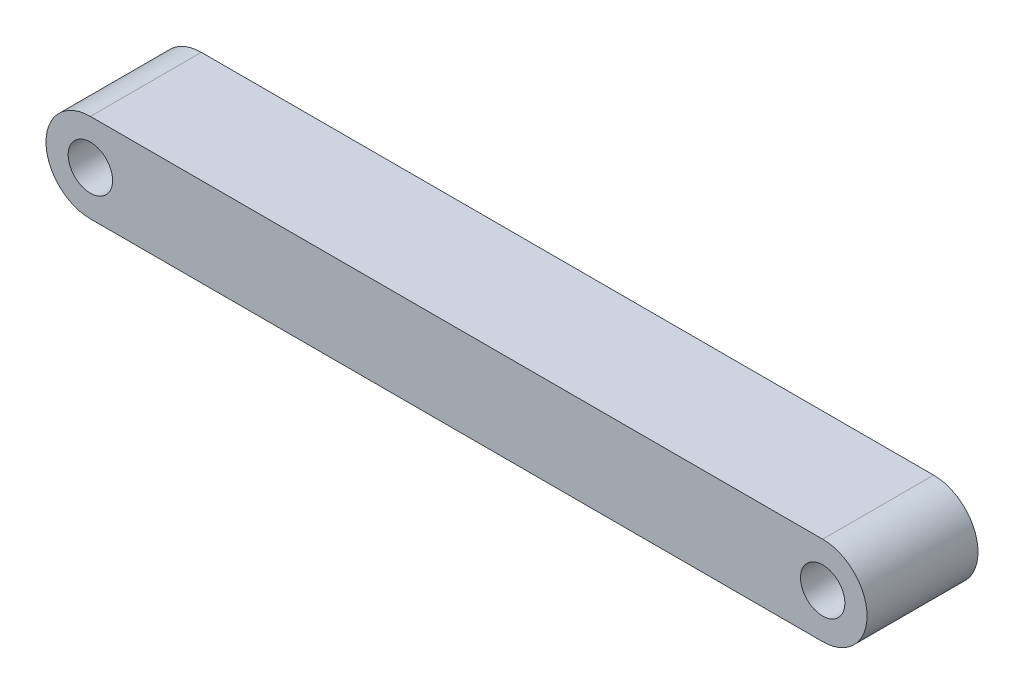
ISO-10303-21;
HEADER;
FILE_DESCRIPTION(('STEP AP214'),'2;1');
FILE_NAME('part.step','',(''),(''),'','','');
FILE_SCHEMA(('AUTOMOTIVE_DESIGN { 1 0 10303 214 1 1 1 1 }'));
ENDSEC;
DATA;
#1=APPLICATION_CONTEXT('core data for automotive mechanical design processes');
#2=APPLICATION_PROTOCOL_DEFINITION('international standard','automotive_design',2000,#1);
#3=PRODUCT_CONTEXT('',#1,'mechanical');
#4=PRODUCT('Part','Part','',(#3));
#5=PRODUCT_RELATED_PRODUCT_CATEGORY('part','',(#4));
#6=PRODUCT_DEFINITION_FORMATION('','',#4);
#7=PRODUCT_DEFINITION_CONTEXT('part definition',#1,'design');
#8=PRODUCT_DEFINITION('design','',#6,#7);
#9=PRODUCT_DEFINITION_SHAPE('','',#8);
#10=(LENGTH_UNIT() NAMED_UNIT(*) SI_UNIT(.MILLI.,.METRE.));
#11=(NAMED_UNIT(*) PLANE_ANGLE_UNIT() SI_UNIT($,.RADIAN.));
#12=(NAMED_UNIT(*) SI_UNIT($,.STERADIAN.) SOLID_ANGLE_UNIT());
#13=UNCERTAINTY_MEASURE_WITH_UNIT(LENGTH_MEASURE(1.E-05),#10,'distance_accuracy_value','');
#14=(GEOMETRIC_REPRESENTATION_CONTEXT(3) GLOBAL_UNCERTAINTY_ASSIGNED_CONTEXT((#13)) GLOBAL_UNIT_ASSIGNED_CONTEXT((#10,
#11,#12)) REPRESENTATION_CONTEXT('',''));
#15=CARTESIAN_POINT('',(0.,0.,0.));
#16=DIRECTION('',(0.,0.,1.));
#17=DIRECTION('',(1.,0.,0.));
#18=AXIS2_PLACEMENT_3D('',#15,#16,#17);
#19=CARTESIAN_POINT('',(0.,0.,10.));
#20=DIRECTION('',(0.,0.,1.));
#21=DIRECTION('',(1.,0.,0.));
#22=AXIS2_PLACEMENT_3D('',#19,#20,#21);
#23=PLANE('',#22);
#24=CARTESIAN_POINT('',(0.,0.,10.));
#25=DIRECTION('',(0.,0.,1.));
#26=DIRECTION('',(1.,0.,0.));
#27=AXIS2_PLACEMENT_3D('',#24,#25,#26);
#28=CIRCLE('',#27,2.);
#29=CARTESIAN_POINT('',(2.,0.,10.));
#30=VERTEX_POINT('',#29);
#31=EDGE_CURVE('E112',#30,#30,#28,.T.);
#32=ORIENTED_EDGE('',*,*,#31,.F.);
#33=EDGE_LOOP('',(#32));
#34=FACE_BOUND('',#33,.T.);
#35=CARTESIAN_POINT('',(0.,0.,10.));
#36=DIRECTION('',(0.,0.,1.));
#37=DIRECTION('',(1.,0.,0.));
#38=AXIS2_PLACEMENT_3D('',#35,#36,#37);
#39=CIRCLE('',#38,4.);
#40=CARTESIAN_POINT('',(0.,4.,10.));
#41=VERTEX_POINT('',#40);
#42=CARTESIAN_POINT('',(0.,-4.,10.));
#43=VERTEX_POINT('',#42);
#44=EDGE_CURVE('E92',#41,#43,#39,.T.);
#45=ORIENTED_EDGE('',*,*,#44,.T.);
#46=DIRECTION('',(1.,0.,0.));
#47=VECTOR('',#46,1.);
#48=CARTESIAN_POINT('',(0.,-4.,10.));
#49=LINE('',#48,#47);
#50=CARTESIAN_POINT('',(66.,-4.,10.));
#51=VERTEX_POINT('',#50);
#52=EDGE_CURVE('E87',#43,#51,#49,.T.);
#53=ORIENTED_EDGE('',*,*,#52,.T.);
#54=CARTESIAN_POINT('',(66.,0.,10.));
#55=DIRECTION('',(0.,0.,1.));
#56=DIRECTION('',(1.,0.,0.));
#57=AXIS2_PLACEMENT_3D('',#54,#55,#56);
#58=CIRCLE('',#57,4.);
#59=CARTESIAN_POINT('',(66.,4.,10.));
#60=VERTEX_POINT('',#59);
#61=EDGE_CURVE('E90',#51,#60,#58,.T.);
#62=ORIENTED_EDGE('',*,*,#61,.T.);
#63=DIRECTION('',(-1.,0.,0.));
#64=VECTOR('',#63,1.);
#65=CARTESIAN_POINT('',(0.,4.,10.));
#66=LINE('',#65,#64);
#67=EDGE_CURVE('E57',#60,#41,#66,.T.);
#68=ORIENTED_EDGE('',*,*,#67,.T.);
#69=EDGE_LOOP('',(#45,#53,#62,#68));
#70=FACE_BOUND('',#69,.T.);
#71=CARTESIAN_POINT('',(66.,0.,10.));
#72=DIRECTION('',(0.,0.,1.));
#73=DIRECTION('',(1.,0.,0.));
#74=AXIS2_PLACEMENT_3D('',#71,#72,#73);
#75=CIRCLE('',#74,2.);
#76=CARTESIAN_POINT('',(68.,0.,10.));
#77=VERTEX_POINT('',#76);
#78=EDGE_CURVE('E134',#77,#77,#75,.T.);
#79=ORIENTED_EDGE('',*,*,#78,.F.);
#80=EDGE_LOOP('',(#79));
#81=FACE_BOUND('',#80,.T.);
#82=ADVANCED_FACE('F39',(#34,#70,#81),#23,.T.);
#83=CARTESIAN_POINT('',(0.,0.,0.));
#84=DIRECTION('',(0.,0.,1.));
#85=DIRECTION('',(1.,0.,0.));
#86=AXIS2_PLACEMENT_3D('',#83,#84,#85);
#87=PLANE('',#86);
#88=CARTESIAN_POINT('',(0.,0.,0.));
#89=DIRECTION('',(0.,0.,1.));
#90=DIRECTION('',(1.,0.,0.));
#91=AXIS2_PLACEMENT_3D('',#88,#89,#90);
#92=CIRCLE('',#91,4.);
#93=CARTESIAN_POINT('',(0.,4.,0.));
#94=VERTEX_POINT('',#93);
#95=CARTESIAN_POINT('',(0.,-4.,0.));
#96=VERTEX_POINT('',#95);
#97=EDGE_CURVE('E108',#94,#96,#92,.T.);
#98=ORIENTED_EDGE('',*,*,#97,.F.);
#99=DIRECTION('',(-1.,0.,0.));
#100=VECTOR('',#99,1.);
#101=CARTESIAN_POINT('',(0.,4.,0.));
#102=LINE('',#101,#100);
#103=CARTESIAN_POINT('',(66.,4.,0.));
#104=VERTEX_POINT('',#103);
#105=EDGE_CURVE('E80',#104,#94,#102,.T.);
#106=ORIENTED_EDGE('',*,*,#105,.F.);
#107=CARTESIAN_POINT('',(66.,0.,0.));
#108=DIRECTION('',(0.,0.,1.));
#109=DIRECTION('',(1.,0.,0.));
#110=AXIS2_PLACEMENT_3D('',#107,#108,#109);
#111=CIRCLE('',#110,4.);
#112=CARTESIAN_POINT('',(66.,-4.,0.));
#113=VERTEX_POINT('',#112);
#114=EDGE_CURVE('E74',#113,#104,#111,.T.);
#115=ORIENTED_EDGE('',*,*,#114,.F.);
#116=DIRECTION('',(1.,0.,0.));
#117=VECTOR('',#116,1.);
#118=CARTESIAN_POINT('',(0.,-4.,0.));
#119=LINE('',#118,#117);
#120=EDGE_CURVE('E97',#96,#113,#119,.T.);
#121=ORIENTED_EDGE('',*,*,#120,.F.);
#122=EDGE_LOOP('',(#98,#106,#115,#121));
#123=FACE_BOUND('',#122,.T.);
#124=CARTESIAN_POINT('',(0.,0.,0.));
#125=DIRECTION('',(0.,0.,1.));
#126=DIRECTION('',(1.,0.,0.));
#127=AXIS2_PLACEMENT_3D('',#124,#125,#126);
#128=CIRCLE('',#127,2.);
#129=CARTESIAN_POINT('',(2.,0.,0.));
#130=VERTEX_POINT('',#129);
#131=EDGE_CURVE('E130',#130,#130,#128,.T.);
#132=ORIENTED_EDGE('',*,*,#131,.T.);
#133=EDGE_LOOP('',(#132));
#134=FACE_BOUND('',#133,.T.);
#135=CARTESIAN_POINT('',(66.,0.,0.));
#136=DIRECTION('',(0.,0.,1.));
#137=DIRECTION('',(1.,0.,0.));
#138=AXIS2_PLACEMENT_3D('',#135,#136,#137);
#139=CIRCLE('',#138,2.);
#140=CARTESIAN_POINT('',(68.,0.,0.));
#141=VERTEX_POINT('',#140);
#142=EDGE_CURVE('E138',#141,#141,#139,.T.);
#143=ORIENTED_EDGE('',*,*,#142,.T.);
#144=EDGE_LOOP('',(#143));
#145=FACE_BOUND('',#144,.T.);
#146=ADVANCED_FACE('F125',(#123,#134,#145),#87,.F.);
#147=CARTESIAN_POINT('',(0.,0.,10.));
#148=DIRECTION('',(0.,0.,-1.));
#149=DIRECTION('',(-1.,0.,0.));
#150=AXIS2_PLACEMENT_3D('',#147,#148,#149);
#151=CYLINDRICAL_SURFACE('',#150,4.);
#152=ORIENTED_EDGE('',*,*,#97,.T.);
#153=DIRECTION('',(0.,0.,-1.));
#154=VECTOR('',#153,1.);
#155=CARTESIAN_POINT('',(0.,-4.,10.));
#156=LINE('',#155,#154);
#157=EDGE_CURVE('E11',#43,#96,#156,.T.);
#158=ORIENTED_EDGE('',*,*,#157,.F.);
#159=ORIENTED_EDGE('',*,*,#44,.F.);
#160=DIRECTION('',(0.,0.,-1.));
#161=VECTOR('',#160,1.);
#162=CARTESIAN_POINT('',(0.,4.,10.));
#163=LINE('',#162,#161);
#164=EDGE_CURVE('E104',#41,#94,#163,.T.);
#165=ORIENTED_EDGE('',*,*,#164,.T.);
#166=EDGE_LOOP('',(#152,#158,#159,#165));
#167=FACE_BOUND('',#166,.T.);
#168=ADVANCED_FACE('F41',(#167),#151,.T.);
#169=CARTESIAN_POINT('',(0.,-4.,10.));
#170=DIRECTION('',(0.,1.,0.));
#171=DIRECTION('',(0.,0.,1.));
#172=AXIS2_PLACEMENT_3D('',#169,#170,#171);
#173=PLANE('',#172);
#174=ORIENTED_EDGE('',*,*,#120,.T.);
#175=DIRECTION('',(0.,0.,-1.));
#176=VECTOR('',#175,1.);
#177=CARTESIAN_POINT('',(66.,-4.,10.));
#178=LINE('',#177,#176);
#179=EDGE_CURVE('E49',#51,#113,#178,.T.);
#180=ORIENTED_EDGE('',*,*,#179,.F.);
#181=ORIENTED_EDGE('',*,*,#52,.F.);
#182=ORIENTED_EDGE('',*,*,#157,.T.);
#183=EDGE_LOOP('',(#174,#180,#181,#182));
#184=FACE_BOUND('',#183,.T.);
#185=ADVANCED_FACE('F96',(#184),#173,.F.);
#186=CARTESIAN_POINT('',(66.,0.,10.));
#187=DIRECTION('',(0.,0.,-1.));
#188=DIRECTION('',(-1.,0.,0.));
#189=AXIS2_PLACEMENT_3D('',#186,#187,#188);
#190=CYLINDRICAL_SURFACE('',#189,4.);
#191=ORIENTED_EDGE('',*,*,#114,.T.);
#192=DIRECTION('',(0.,0.,-1.));
#193=VECTOR('',#192,1.);
#194=CARTESIAN_POINT('',(66.,4.,10.));
#195=LINE('',#194,#193);
#196=EDGE_CURVE('E99',#60,#104,#195,.T.);
#197=ORIENTED_EDGE('',*,*,#196,.F.);
#198=ORIENTED_EDGE('',*,*,#61,.F.);
#199=ORIENTED_EDGE('',*,*,#179,.T.);
#200=EDGE_LOOP('',(#191,#197,#198,#199));
#201=FACE_BOUND('',#200,.T.);
#202=ADVANCED_FACE('F100',(#201),#190,.T.);
#203=CARTESIAN_POINT('',(0.,4.,10.));
#204=DIRECTION('',(0.,-1.,0.));
#205=DIRECTION('',(0.,0.,-1.));
#206=AXIS2_PLACEMENT_3D('',#203,#204,#205);
#207=PLANE('',#206);
#208=ORIENTED_EDGE('',*,*,#105,.T.);
#209=ORIENTED_EDGE('',*,*,#164,.F.);
#210=ORIENTED_EDGE('',*,*,#67,.F.);
#211=ORIENTED_EDGE('',*,*,#196,.T.);
#212=EDGE_LOOP('',(#208,#209,#210,#211));
#213=FACE_BOUND('',#212,.T.);
#214=ADVANCED_FACE('F122',(#213),#207,.F.);
#215=CARTESIAN_POINT('',(0.,0.,10.));
#216=DIRECTION('',(0.,0.,-1.));
#217=DIRECTION('',(-1.,0.,0.));
#218=AXIS2_PLACEMENT_3D('',#215,#216,#217);
#219=CYLINDRICAL_SURFACE('',#218,2.);
#220=ORIENTED_EDGE('',*,*,#31,.T.);
#221=EDGE_LOOP('',(#220));
#222=FACE_BOUND('',#221,.T.);
#223=ORIENTED_EDGE('',*,*,#131,.F.);
#224=EDGE_LOOP('',(#223));
#225=FACE_BOUND('',#224,.T.);
#226=ADVANCED_FACE('F157',(#222,#225),#219,.F.);
#227=CARTESIAN_POINT('',(66.,0.,10.));
#228=DIRECTION('',(0.,0.,-1.));
#229=DIRECTION('',(-1.,0.,0.));
#230=AXIS2_PLACEMENT_3D('',#227,#228,#229);
#231=CYLINDRICAL_SURFACE('',#230,2.);
#232=ORIENTED_EDGE('',*,*,#78,.T.);
#233=EDGE_LOOP('',(#232));
#234=FACE_BOUND('',#233,.T.);
#235=ORIENTED_EDGE('',*,*,#142,.F.);
#236=EDGE_LOOP('',(#235));
#237=FACE_BOUND('',#236,.T.);
#238=ADVANCED_FACE('F146',(#234,#237),#231,.F.);
#239=CLOSED_SHELL('',(#82,#146,#168,#185,#202,#214,#226,#238));
#240=MANIFOLD_SOLID_BREP('B2',#239);
#241=ADVANCED_BREP_SHAPE_REPRESENTATION('',(#18,#240),#14);
#242=SHAPE_DEFINITION_REPRESENTATION(#9,#241);
ENDSEC;
END-ISO-10303-21;
